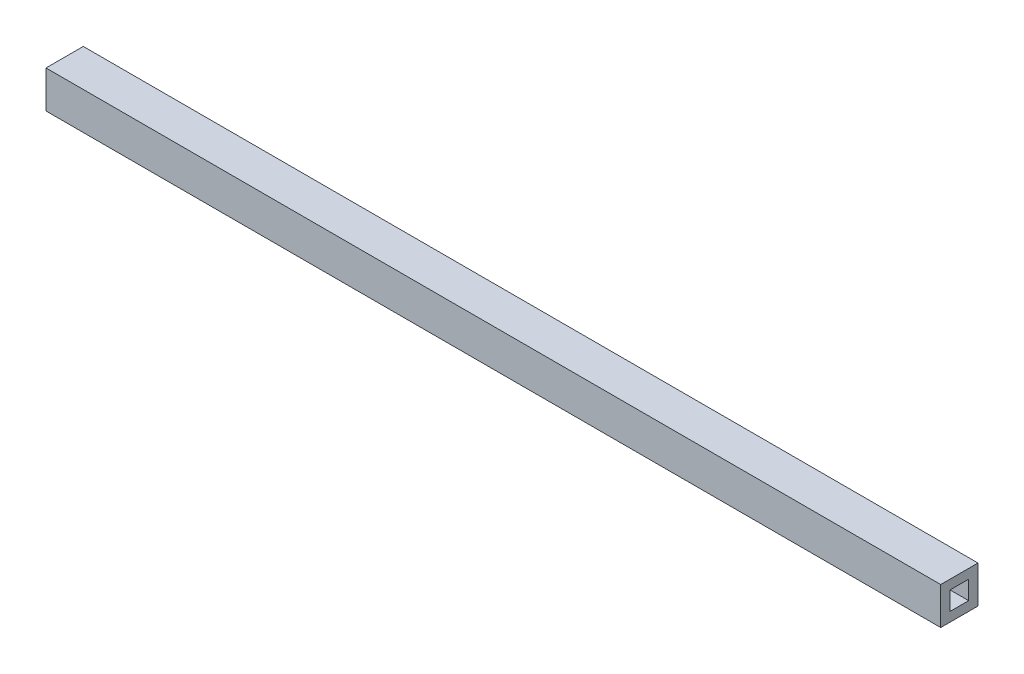
ISO-10303-21;
HEADER;
FILE_DESCRIPTION(('STEP AP214'),'2;1');
FILE_NAME('part.step','',(''),(''),'','','');
FILE_SCHEMA(('AUTOMOTIVE_DESIGN { 1 0 10303 214 1 1 1 1 }'));
ENDSEC;
DATA;
#1=APPLICATION_CONTEXT('core data for automotive mechanical design processes');
#2=APPLICATION_PROTOCOL_DEFINITION('international standard','automotive_design',2000,#1);
#3=PRODUCT_CONTEXT('',#1,'mechanical');
#4=PRODUCT('Part','Part','',(#3));
#5=PRODUCT_RELATED_PRODUCT_CATEGORY('part','',(#4));
#6=PRODUCT_DEFINITION_FORMATION('','',#4);
#7=PRODUCT_DEFINITION_CONTEXT('part definition',#1,'design');
#8=PRODUCT_DEFINITION('design','',#6,#7);
#9=PRODUCT_DEFINITION_SHAPE('','',#8);
#10=(LENGTH_UNIT() NAMED_UNIT(*) SI_UNIT(.MILLI.,.METRE.));
#11=(NAMED_UNIT(*) PLANE_ANGLE_UNIT() SI_UNIT($,.RADIAN.));
#12=(NAMED_UNIT(*) SI_UNIT($,.STERADIAN.) SOLID_ANGLE_UNIT());
#13=UNCERTAINTY_MEASURE_WITH_UNIT(LENGTH_MEASURE(1.E-05),#10,'distance_accuracy_value','');
#14=(GEOMETRIC_REPRESENTATION_CONTEXT(3) GLOBAL_UNCERTAINTY_ASSIGNED_CONTEXT((#13)) GLOBAL_UNIT_ASSIGNED_CONTEXT((#10,
#11,#12)) REPRESENTATION_CONTEXT('',''));
#15=CARTESIAN_POINT('',(0.,0.,0.));
#16=DIRECTION('',(0.,0.,1.));
#17=DIRECTION('',(1.,0.,0.));
#18=AXIS2_PLACEMENT_3D('',#15,#16,#17);
#19=CARTESIAN_POINT('',(152.4,-6.35000000000001,12.7));
#20=DIRECTION('',(-1.,0.,0.));
#21=DIRECTION('',(0.,0.,1.));
#22=AXIS2_PLACEMENT_3D('',#19,#20,#21);
#23=PLANE('',#22);
#24=DIRECTION('',(0.,0.,-1.));
#25=VECTOR('',#24,1.);
#26=CARTESIAN_POINT('',(152.4,-3.175,3.175));
#27=LINE('',#26,#25);
#28=CARTESIAN_POINT('',(152.4,-3.175,9.525));
#29=VERTEX_POINT('',#28);
#30=CARTESIAN_POINT('',(152.4,-3.175,3.175));
#31=VERTEX_POINT('',#30);
#32=EDGE_CURVE('E124',#29,#31,#27,.T.);
#33=ORIENTED_EDGE('',*,*,#32,.F.);
#34=DIRECTION('',(0.,-1.,0.));
#35=VECTOR('',#34,1.);
#36=CARTESIAN_POINT('',(152.4,-3.175,9.525));
#37=LINE('',#36,#35);
#38=CARTESIAN_POINT('',(152.4,3.175,9.525));
#39=VERTEX_POINT('',#38);
#40=EDGE_CURVE('E47',#39,#29,#37,.T.);
#41=ORIENTED_EDGE('',*,*,#40,.F.);
#42=DIRECTION('',(0.,0.,1.));
#43=VECTOR('',#42,1.);
#44=CARTESIAN_POINT('',(152.4,3.175,3.175));
#45=LINE('',#44,#43);
#46=CARTESIAN_POINT('',(152.4,3.175,3.175));
#47=VERTEX_POINT('',#46);
#48=EDGE_CURVE('E115',#47,#39,#45,.T.);
#49=ORIENTED_EDGE('',*,*,#48,.F.);
#50=DIRECTION('',(0.,1.,0.));
#51=VECTOR('',#50,1.);
#52=CARTESIAN_POINT('',(152.4,-3.175,3.175));
#53=LINE('',#52,#51);
#54=EDGE_CURVE('E118',#31,#47,#53,.T.);
#55=ORIENTED_EDGE('',*,*,#54,.F.);
#56=EDGE_LOOP('',(#33,#41,#49,#55));
#57=FACE_BOUND('',#56,.T.);
#58=DIRECTION('',(0.,1.,0.));
#59=VECTOR('',#58,1.);
#60=CARTESIAN_POINT('',(152.4,-6.35000000000001,0.));
#61=LINE('',#60,#59);
#62=CARTESIAN_POINT('',(152.4,-6.35000000000001,0.));
#63=VERTEX_POINT('',#62);
#64=CARTESIAN_POINT('',(152.4,6.35000000000001,0.));
#65=VERTEX_POINT('',#64);
#66=EDGE_CURVE('E130',#63,#65,#61,.T.);
#67=ORIENTED_EDGE('',*,*,#66,.T.);
#68=DIRECTION('',(0.,0.,-1.));
#69=VECTOR('',#68,1.);
#70=CARTESIAN_POINT('',(152.4,6.35000000000001,12.7));
#71=LINE('',#70,#69);
#72=CARTESIAN_POINT('',(152.4,6.35000000000001,12.7));
#73=VERTEX_POINT('',#72);
#74=EDGE_CURVE('E11',#73,#65,#71,.T.);
#75=ORIENTED_EDGE('',*,*,#74,.F.);
#76=DIRECTION('',(0.,1.,0.));
#77=VECTOR('',#76,1.);
#78=CARTESIAN_POINT('',(152.4,-6.35000000000001,12.7));
#79=LINE('',#78,#77);
#80=CARTESIAN_POINT('',(152.4,-6.35000000000001,12.7));
#81=VERTEX_POINT('',#80);
#82=EDGE_CURVE('E134',#81,#73,#79,.T.);
#83=ORIENTED_EDGE('',*,*,#82,.F.);
#84=DIRECTION('',(0.,0.,-1.));
#85=VECTOR('',#84,1.);
#86=CARTESIAN_POINT('',(152.4,-6.35000000000001,12.7));
#87=LINE('',#86,#85);
#88=EDGE_CURVE('E144',#81,#63,#87,.T.);
#89=ORIENTED_EDGE('',*,*,#88,.T.);
#90=EDGE_LOOP('',(#67,#75,#83,#89));
#91=FACE_BOUND('',#90,.T.);
#92=ADVANCED_FACE('F33',(#57,#91),#23,.F.);
#93=CARTESIAN_POINT('',(-152.4,6.35000000000001,12.7));
#94=DIRECTION('',(0.,-1.,0.));
#95=DIRECTION('',(0.,0.,-1.));
#96=AXIS2_PLACEMENT_3D('',#93,#94,#95);
#97=PLANE('',#96);
#98=DIRECTION('',(-1.,0.,0.));
#99=VECTOR('',#98,1.);
#100=CARTESIAN_POINT('',(-152.4,6.35000000000001,0.));
#101=LINE('',#100,#99);
#102=CARTESIAN_POINT('',(-152.4,6.35000000000001,0.));
#103=VERTEX_POINT('',#102);
#104=EDGE_CURVE('E147',#65,#103,#101,.T.);
#105=ORIENTED_EDGE('',*,*,#104,.T.);
#106=DIRECTION('',(0.,0.,-1.));
#107=VECTOR('',#106,1.);
#108=CARTESIAN_POINT('',(-152.4,6.35000000000001,12.7));
#109=LINE('',#108,#107);
#110=CARTESIAN_POINT('',(-152.4,6.35000000000001,12.7));
#111=VERTEX_POINT('',#110);
#112=EDGE_CURVE('E40',#111,#103,#109,.T.);
#113=ORIENTED_EDGE('',*,*,#112,.F.);
#114=DIRECTION('',(-1.,0.,0.));
#115=VECTOR('',#114,1.);
#116=CARTESIAN_POINT('',(-152.4,6.35000000000001,12.7));
#117=LINE('',#116,#115);
#118=EDGE_CURVE('E137',#73,#111,#117,.T.);
#119=ORIENTED_EDGE('',*,*,#118,.F.);
#120=ORIENTED_EDGE('',*,*,#74,.T.);
#121=EDGE_LOOP('',(#105,#113,#119,#120));
#122=FACE_BOUND('',#121,.T.);
#123=ADVANCED_FACE('F175',(#122),#97,.F.);
#124=CARTESIAN_POINT('',(-152.4,-6.35000000000001,12.7));
#125=DIRECTION('',(1.,0.,0.));
#126=DIRECTION('',(0.,0.,-1.));
#127=AXIS2_PLACEMENT_3D('',#124,#125,#126);
#128=PLANE('',#127);
#129=DIRECTION('',(0.,0.,1.));
#130=VECTOR('',#129,1.);
#131=CARTESIAN_POINT('',(-152.4,3.175,3.175));
#132=LINE('',#131,#130);
#133=CARTESIAN_POINT('',(-152.4,3.175,3.175));
#134=VERTEX_POINT('',#133);
#135=CARTESIAN_POINT('',(-152.4,3.175,9.525));
#136=VERTEX_POINT('',#135);
#137=EDGE_CURVE('E105',#134,#136,#132,.T.);
#138=ORIENTED_EDGE('',*,*,#137,.T.);
#139=DIRECTION('',(0.,-1.,0.));
#140=VECTOR('',#139,1.);
#141=CARTESIAN_POINT('',(-152.4,-3.175,9.525));
#142=LINE('',#141,#140);
#143=CARTESIAN_POINT('',(-152.4,-3.175,9.525));
#144=VERTEX_POINT('',#143);
#145=EDGE_CURVE('E99',#136,#144,#142,.T.);
#146=ORIENTED_EDGE('',*,*,#145,.T.);
#147=DIRECTION('',(0.,0.,-1.));
#148=VECTOR('',#147,1.);
#149=CARTESIAN_POINT('',(-152.4,-3.175,3.175));
#150=LINE('',#149,#148);
#151=CARTESIAN_POINT('',(-152.4,-3.175,3.175));
#152=VERTEX_POINT('',#151);
#153=EDGE_CURVE('E108',#144,#152,#150,.T.);
#154=ORIENTED_EDGE('',*,*,#153,.T.);
#155=DIRECTION('',(0.,1.,0.));
#156=VECTOR('',#155,1.);
#157=CARTESIAN_POINT('',(-152.4,-3.175,3.175));
#158=LINE('',#157,#156);
#159=EDGE_CURVE('E55',#152,#134,#158,.T.);
#160=ORIENTED_EDGE('',*,*,#159,.T.);
#161=EDGE_LOOP('',(#138,#146,#154,#160));
#162=FACE_BOUND('',#161,.T.);
#163=DIRECTION('',(0.,-1.,0.));
#164=VECTOR('',#163,1.);
#165=CARTESIAN_POINT('',(-152.4,-6.35000000000001,0.));
#166=LINE('',#165,#164);
#167=CARTESIAN_POINT('',(-152.4,-6.35000000000001,0.));
#168=VERTEX_POINT('',#167);
#169=EDGE_CURVE('E149',#103,#168,#166,.T.);
#170=ORIENTED_EDGE('',*,*,#169,.T.);
#171=DIRECTION('',(0.,0.,-1.));
#172=VECTOR('',#171,1.);
#173=CARTESIAN_POINT('',(-152.4,-6.35000000000001,12.7));
#174=LINE('',#173,#172);
#175=CARTESIAN_POINT('',(-152.4,-6.35000000000001,12.7));
#176=VERTEX_POINT('',#175);
#177=EDGE_CURVE('E154',#176,#168,#174,.T.);
#178=ORIENTED_EDGE('',*,*,#177,.F.);
#179=DIRECTION('',(0.,-1.,0.));
#180=VECTOR('',#179,1.);
#181=CARTESIAN_POINT('',(-152.4,-6.35000000000001,12.7));
#182=LINE('',#181,#180);
#183=EDGE_CURVE('E140',#111,#176,#182,.T.);
#184=ORIENTED_EDGE('',*,*,#183,.F.);
#185=ORIENTED_EDGE('',*,*,#112,.T.);
#186=EDGE_LOOP('',(#170,#178,#184,#185));
#187=FACE_BOUND('',#186,.T.);
#188=ADVANCED_FACE('F112',(#162,#187),#128,.F.);
#189=CARTESIAN_POINT('',(-152.4,-6.35000000000001,12.7));
#190=DIRECTION('',(0.,1.,0.));
#191=DIRECTION('',(0.,0.,1.));
#192=AXIS2_PLACEMENT_3D('',#189,#190,#191);
#193=PLANE('',#192);
#194=DIRECTION('',(1.,0.,0.));
#195=VECTOR('',#194,1.);
#196=CARTESIAN_POINT('',(-152.4,-6.35000000000001,0.));
#197=LINE('',#196,#195);
#198=EDGE_CURVE('E138',#168,#63,#197,.T.);
#199=ORIENTED_EDGE('',*,*,#198,.T.);
#200=ORIENTED_EDGE('',*,*,#88,.F.);
#201=DIRECTION('',(1.,0.,0.));
#202=VECTOR('',#201,1.);
#203=CARTESIAN_POINT('',(-152.4,-6.35000000000001,12.7));
#204=LINE('',#203,#202);
#205=EDGE_CURVE('E142',#176,#81,#204,.T.);
#206=ORIENTED_EDGE('',*,*,#205,.F.);
#207=ORIENTED_EDGE('',*,*,#177,.T.);
#208=EDGE_LOOP('',(#199,#200,#206,#207));
#209=FACE_BOUND('',#208,.T.);
#210=ADVANCED_FACE('F168',(#209),#193,.F.);
#211=CARTESIAN_POINT('',(0.,0.,12.7));
#212=DIRECTION('',(0.,0.,-1.));
#213=DIRECTION('',(-1.,0.,0.));
#214=AXIS2_PLACEMENT_3D('',#211,#212,#213);
#215=PLANE('',#214);
#216=ORIENTED_EDGE('',*,*,#82,.T.);
#217=ORIENTED_EDGE('',*,*,#118,.T.);
#218=ORIENTED_EDGE('',*,*,#183,.T.);
#219=ORIENTED_EDGE('',*,*,#205,.T.);
#220=EDGE_LOOP('',(#216,#217,#218,#219));
#221=FACE_BOUND('',#220,.T.);
#222=ADVANCED_FACE('F174',(#221),#215,.F.);
#223=CARTESIAN_POINT('',(0.,0.,0.));
#224=DIRECTION('',(0.,0.,-1.));
#225=DIRECTION('',(-1.,0.,0.));
#226=AXIS2_PLACEMENT_3D('',#223,#224,#225);
#227=PLANE('',#226);
#228=ORIENTED_EDGE('',*,*,#66,.F.);
#229=ORIENTED_EDGE('',*,*,#198,.F.);
#230=ORIENTED_EDGE('',*,*,#169,.F.);
#231=ORIENTED_EDGE('',*,*,#104,.F.);
#232=EDGE_LOOP('',(#228,#229,#230,#231));
#233=FACE_BOUND('',#232,.T.);
#234=ADVANCED_FACE('F165',(#233),#227,.T.);
#235=CARTESIAN_POINT('',(-152.4,-3.175,9.525));
#236=DIRECTION('',(0.,0.,1.));
#237=DIRECTION('',(1.,0.,0.));
#238=AXIS2_PLACEMENT_3D('',#235,#236,#237);
#239=PLANE('',#238);
#240=ORIENTED_EDGE('',*,*,#40,.T.);
#241=DIRECTION('',(1.,0.,0.));
#242=VECTOR('',#241,1.);
#243=CARTESIAN_POINT('',(-152.4,-3.175,9.525));
#244=LINE('',#243,#242);
#245=EDGE_CURVE('E95',#144,#29,#244,.T.);
#246=ORIENTED_EDGE('',*,*,#245,.F.);
#247=ORIENTED_EDGE('',*,*,#145,.F.);
#248=DIRECTION('',(1.,0.,0.));
#249=VECTOR('',#248,1.);
#250=CARTESIAN_POINT('',(-152.4,3.175,9.525));
#251=LINE('',#250,#249);
#252=EDGE_CURVE('E128',#136,#39,#251,.T.);
#253=ORIENTED_EDGE('',*,*,#252,.T.);
#254=EDGE_LOOP('',(#240,#246,#247,#253));
#255=FACE_BOUND('',#254,.T.);
#256=ADVANCED_FACE('F97',(#255),#239,.F.);
#257=CARTESIAN_POINT('',(-152.4,3.175,3.175));
#258=DIRECTION('',(0.,1.,0.));
#259=DIRECTION('',(0.,0.,1.));
#260=AXIS2_PLACEMENT_3D('',#257,#258,#259);
#261=PLANE('',#260);
#262=ORIENTED_EDGE('',*,*,#48,.T.);
#263=ORIENTED_EDGE('',*,*,#252,.F.);
#264=ORIENTED_EDGE('',*,*,#137,.F.);
#265=DIRECTION('',(1.,0.,0.));
#266=VECTOR('',#265,1.);
#267=CARTESIAN_POINT('',(-152.4,3.175,3.175));
#268=LINE('',#267,#266);
#269=EDGE_CURVE('E131',#134,#47,#268,.T.);
#270=ORIENTED_EDGE('',*,*,#269,.T.);
#271=EDGE_LOOP('',(#262,#263,#264,#270));
#272=FACE_BOUND('',#271,.T.);
#273=ADVANCED_FACE('F192',(#272),#261,.F.);
#274=CARTESIAN_POINT('',(-152.4,-3.175,3.175));
#275=DIRECTION('',(0.,0.,-1.));
#276=DIRECTION('',(-1.,0.,0.));
#277=AXIS2_PLACEMENT_3D('',#274,#275,#276);
#278=PLANE('',#277);
#279=ORIENTED_EDGE('',*,*,#54,.T.);
#280=ORIENTED_EDGE('',*,*,#269,.F.);
#281=ORIENTED_EDGE('',*,*,#159,.F.);
#282=DIRECTION('',(1.,0.,0.));
#283=VECTOR('',#282,1.);
#284=CARTESIAN_POINT('',(-152.4,-3.175,3.175));
#285=LINE('',#284,#283);
#286=EDGE_CURVE('E104',#152,#31,#285,.T.);
#287=ORIENTED_EDGE('',*,*,#286,.T.);
#288=EDGE_LOOP('',(#279,#280,#281,#287));
#289=FACE_BOUND('',#288,.T.);
#290=ADVANCED_FACE('F195',(#289),#278,.F.);
#291=CARTESIAN_POINT('',(-152.4,-3.175,3.175));
#292=DIRECTION('',(0.,-1.,0.));
#293=DIRECTION('',(0.,0.,-1.));
#294=AXIS2_PLACEMENT_3D('',#291,#292,#293);
#295=PLANE('',#294);
#296=ORIENTED_EDGE('',*,*,#32,.T.);
#297=ORIENTED_EDGE('',*,*,#286,.F.);
#298=ORIENTED_EDGE('',*,*,#153,.F.);
#299=ORIENTED_EDGE('',*,*,#245,.T.);
#300=EDGE_LOOP('',(#296,#297,#298,#299));
#301=FACE_BOUND('',#300,.T.);
#302=ADVANCED_FACE('F109',(#301),#295,.F.);
#303=CLOSED_SHELL('',(#92,#123,#188,#210,#222,#234,#256,#273,#290,#302));
#304=MANIFOLD_SOLID_BREP('B2',#303);
#305=ADVANCED_BREP_SHAPE_REPRESENTATION('',(#18,#304),#14);
#306=SHAPE_DEFINITION_REPRESENTATION(#9,#305);
ENDSEC;
END-ISO-10303-21;
